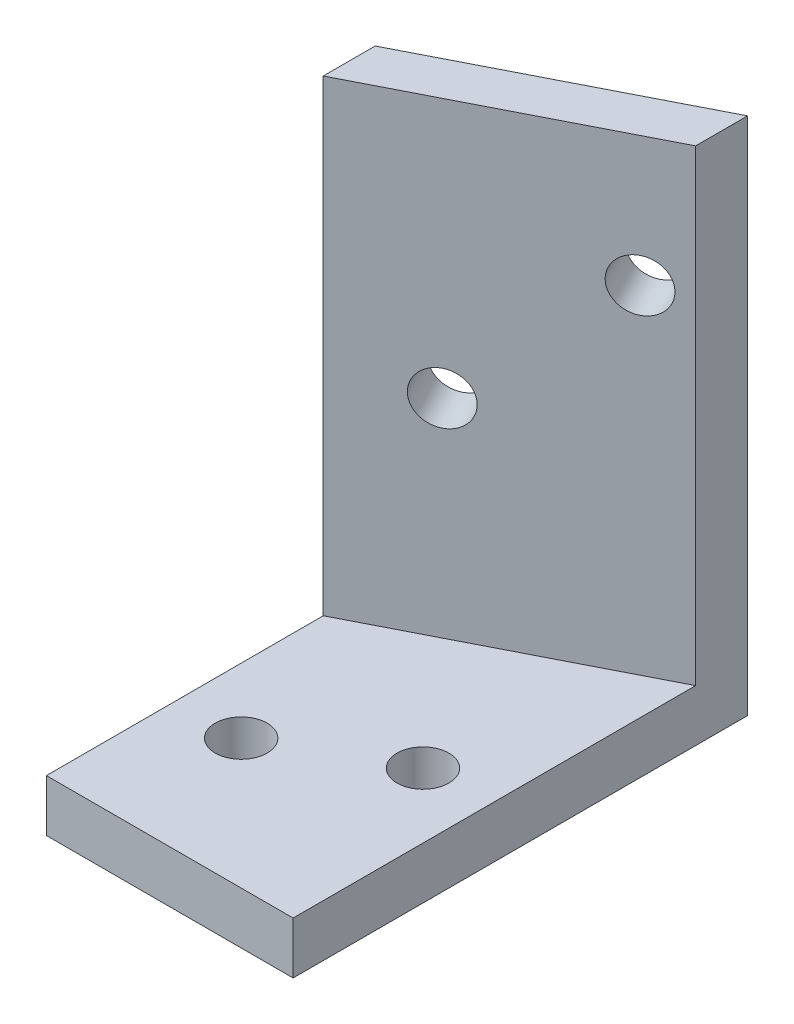
ISO-10303-21;
HEADER;
FILE_DESCRIPTION(('STEP AP214'),'2;1');
FILE_NAME('part.step','',(''),(''),'','','');
FILE_SCHEMA(('AUTOMOTIVE_DESIGN { 1 0 10303 214 1 1 1 1 }'));
ENDSEC;
DATA;
#1=APPLICATION_CONTEXT('core data for automotive mechanical design processes');
#2=APPLICATION_PROTOCOL_DEFINITION('international standard','automotive_design',2000,#1);
#3=PRODUCT_CONTEXT('',#1,'mechanical');
#4=PRODUCT('Part','Part','',(#3));
#5=PRODUCT_RELATED_PRODUCT_CATEGORY('part','',(#4));
#6=PRODUCT_DEFINITION_FORMATION('','',#4);
#7=PRODUCT_DEFINITION_CONTEXT('part definition',#1,'design');
#8=PRODUCT_DEFINITION('design','',#6,#7);
#9=PRODUCT_DEFINITION_SHAPE('','',#8);
#10=(LENGTH_UNIT() NAMED_UNIT(*) SI_UNIT(.MILLI.,.METRE.));
#11=(NAMED_UNIT(*) PLANE_ANGLE_UNIT() SI_UNIT($,.RADIAN.));
#12=(NAMED_UNIT(*) SI_UNIT($,.STERADIAN.) SOLID_ANGLE_UNIT());
#13=UNCERTAINTY_MEASURE_WITH_UNIT(LENGTH_MEASURE(1.E-05),#10,'distance_accuracy_value','');
#14=(GEOMETRIC_REPRESENTATION_CONTEXT(3) GLOBAL_UNCERTAINTY_ASSIGNED_CONTEXT((#13)) GLOBAL_UNIT_ASSIGNED_CONTEXT((#10,
#11,#12)) REPRESENTATION_CONTEXT('',''));
#15=CARTESIAN_POINT('',(0.,0.,0.));
#16=DIRECTION('',(0.,0.,1.));
#17=DIRECTION('',(1.,0.,0.));
#18=AXIS2_PLACEMENT_3D('',#15,#16,#17);
#19=CARTESIAN_POINT('',(0.,4.,0.));
#20=DIRECTION('',(0.,-1.,0.));
#21=DIRECTION('',(0.,0.,-1.));
#22=AXIS2_PLACEMENT_3D('',#19,#20,#21);
#23=PLANE('',#22);
#24=CARTESIAN_POINT('',(-4.5,4.,7.5));
#25=DIRECTION('',(0.,1.,0.));
#26=DIRECTION('',(0.,0.,1.));
#27=AXIS2_PLACEMENT_3D('',#24,#25,#26);
#28=CIRCLE('',#27,2.);
#29=CARTESIAN_POINT('',(-4.5,4.,9.5));
#30=VERTEX_POINT('',#29);
#31=EDGE_CURVE('E314',#30,#30,#28,.T.);
#32=ORIENTED_EDGE('',*,*,#31,.F.);
#33=EDGE_LOOP('',(#32));
#34=FACE_BOUND('',#33,.T.);
#35=CARTESIAN_POINT('',(4.5,4.,2.5));
#36=DIRECTION('',(0.,1.,0.));
#37=DIRECTION('',(0.,0.,1.));
#38=AXIS2_PLACEMENT_3D('',#35,#36,#37);
#39=CIRCLE('',#38,2.);
#40=CARTESIAN_POINT('',(4.5,4.,4.5));
#41=VERTEX_POINT('',#40);
#42=EDGE_CURVE('E316',#41,#41,#39,.T.);
#43=ORIENTED_EDGE('',*,*,#42,.F.);
#44=EDGE_LOOP('',(#43));
#45=FACE_BOUND('',#44,.T.);
#46=DIRECTION('',(0.891006524188369,0.,-0.453990499739545));
#47=VECTOR('',#46,1.);
#48=CARTESIAN_POINT('',(-9.5,4.,-3.81901645960591));
#49=LINE('',#48,#47);
#50=CARTESIAN_POINT('',(-9.5,4.,-3.8190164596059));
#51=VERTEX_POINT('',#50);
#52=CARTESIAN_POINT('',(9.5,4.,-13.5));
#53=VERTEX_POINT('',#52);
#54=EDGE_CURVE('E60',#51,#53,#49,.T.);
#55=ORIENTED_EDGE('',*,*,#54,.F.);
#56=DIRECTION('',(0.,0.,1.));
#57=VECTOR('',#56,1.);
#58=CARTESIAN_POINT('',(-9.5,4.,17.5));
#59=LINE('',#58,#57);
#60=CARTESIAN_POINT('',(-9.5,4.,17.5));
#61=VERTEX_POINT('',#60);
#62=EDGE_CURVE('E167',#51,#61,#59,.T.);
#63=ORIENTED_EDGE('',*,*,#62,.T.);
#64=DIRECTION('',(1.,0.,0.));
#65=VECTOR('',#64,1.);
#66=CARTESIAN_POINT('',(-9.5,4.,17.5));
#67=LINE('',#66,#65);
#68=CARTESIAN_POINT('',(9.5,4.,17.5));
#69=VERTEX_POINT('',#68);
#70=EDGE_CURVE('E66',#61,#69,#67,.T.);
#71=ORIENTED_EDGE('',*,*,#70,.T.);
#72=DIRECTION('',(0.,0.,-1.));
#73=VECTOR('',#72,1.);
#74=CARTESIAN_POINT('',(9.5,4.,17.5));
#75=LINE('',#74,#73);
#76=EDGE_CURVE('E91',#69,#53,#75,.T.);
#77=ORIENTED_EDGE('',*,*,#76,.T.);
#78=EDGE_LOOP('',(#55,#63,#71,#77));
#79=FACE_BOUND('',#78,.T.);
#80=ADVANCED_FACE('F42',(#34,#45,#79),#23,.F.);
#81=CARTESIAN_POINT('',(9.5,4.,17.5));
#82=DIRECTION('',(-1.,0.,0.));
#83=DIRECTION('',(0.,0.,1.));
#84=AXIS2_PLACEMENT_3D('',#81,#82,#83);
#85=PLANE('',#84);
#86=DIRECTION('',(0.,0.,-1.));
#87=VECTOR('',#86,1.);
#88=CARTESIAN_POINT('',(9.5,0.,17.5));
#89=LINE('',#88,#87);
#90=CARTESIAN_POINT('',(9.5,0.,17.5));
#91=VERTEX_POINT('',#90);
#92=CARTESIAN_POINT('',(9.5,0.,-17.5));
#93=VERTEX_POINT('',#92);
#94=EDGE_CURVE('E97',#91,#93,#89,.T.);
#95=ORIENTED_EDGE('',*,*,#94,.T.);
#96=DIRECTION('',(0.,-1.,0.));
#97=VECTOR('',#96,1.);
#98=CARTESIAN_POINT('',(9.5,4.,-17.5));
#99=LINE('',#98,#97);
#100=CARTESIAN_POINT('',(9.5,40.,-17.5));
#101=VERTEX_POINT('',#100);
#102=EDGE_CURVE('E11',#101,#93,#99,.T.);
#103=ORIENTED_EDGE('',*,*,#102,.F.);
#104=DIRECTION('',(0.,0.,-1.));
#105=VECTOR('',#104,1.);
#106=CARTESIAN_POINT('',(9.5,40.,-13.5));
#107=LINE('',#106,#105);
#108=CARTESIAN_POINT('',(9.5,40.,-13.5));
#109=VERTEX_POINT('',#108);
#110=EDGE_CURVE('E139',#109,#101,#107,.T.);
#111=ORIENTED_EDGE('',*,*,#110,.F.);
#112=DIRECTION('',(0.,-1.,0.));
#113=VECTOR('',#112,1.);
#114=CARTESIAN_POINT('',(9.5,40.,-13.5));
#115=LINE('',#114,#113);
#116=EDGE_CURVE('E155',#109,#53,#115,.T.);
#117=ORIENTED_EDGE('',*,*,#116,.T.);
#118=ORIENTED_EDGE('',*,*,#76,.F.);
#119=DIRECTION('',(0.,-1.,0.));
#120=VECTOR('',#119,1.);
#121=CARTESIAN_POINT('',(9.5,4.,17.5));
#122=LINE('',#121,#120);
#123=EDGE_CURVE('E84',#69,#91,#122,.T.);
#124=ORIENTED_EDGE('',*,*,#123,.T.);
#125=EDGE_LOOP('',(#95,#103,#111,#117,#118,#124));
#126=FACE_BOUND('',#125,.T.);
#127=ADVANCED_FACE('F44',(#126),#85,.F.);
#128=CARTESIAN_POINT('',(-9.5,4.,17.5));
#129=DIRECTION('',(1.,0.,0.));
#130=DIRECTION('',(0.,0.,-1.));
#131=AXIS2_PLACEMENT_3D('',#128,#129,#130);
#132=PLANE('',#131);
#133=ORIENTED_EDGE('',*,*,#62,.F.);
#134=DIRECTION('',(0.,-1.,0.));
#135=VECTOR('',#134,1.);
#136=CARTESIAN_POINT('',(-9.5,40.,-3.81901645960591));
#137=LINE('',#136,#135);
#138=CARTESIAN_POINT('',(-9.5,40.,-3.81901645960591));
#139=VERTEX_POINT('',#138);
#140=EDGE_CURVE('E160',#139,#51,#137,.T.);
#141=ORIENTED_EDGE('',*,*,#140,.F.);
#142=DIRECTION('',(0.,0.,1.));
#143=VECTOR('',#142,1.);
#144=CARTESIAN_POINT('',(-9.5,40.,-7.81901645960591));
#145=LINE('',#144,#143);
#146=CARTESIAN_POINT('',(-9.5,40.,-7.81901645960591));
#147=VERTEX_POINT('',#146);
#148=EDGE_CURVE('E147',#147,#139,#145,.T.);
#149=ORIENTED_EDGE('',*,*,#148,.F.);
#150=DIRECTION('',(0.,1.,0.));
#151=VECTOR('',#150,1.);
#152=CARTESIAN_POINT('',(-9.5,0.,-7.81901645960591));
#153=LINE('',#152,#151);
#154=CARTESIAN_POINT('',(-9.5,0.,-7.81901645960591));
#155=VERTEX_POINT('',#154);
#156=EDGE_CURVE('E106',#155,#147,#153,.T.);
#157=ORIENTED_EDGE('',*,*,#156,.F.);
#158=DIRECTION('',(0.,0.,1.));
#159=VECTOR('',#158,1.);
#160=CARTESIAN_POINT('',(-9.5,0.,17.5));
#161=LINE('',#160,#159);
#162=CARTESIAN_POINT('',(-9.5,0.,17.5));
#163=VERTEX_POINT('',#162);
#164=EDGE_CURVE('E92',#155,#163,#161,.T.);
#165=ORIENTED_EDGE('',*,*,#164,.T.);
#166=DIRECTION('',(0.,-1.,0.));
#167=VECTOR('',#166,1.);
#168=CARTESIAN_POINT('',(-9.5,4.,17.5));
#169=LINE('',#168,#167);
#170=EDGE_CURVE('E52',#61,#163,#169,.T.);
#171=ORIENTED_EDGE('',*,*,#170,.F.);
#172=EDGE_LOOP('',(#133,#141,#149,#157,#165,#171));
#173=FACE_BOUND('',#172,.T.);
#174=ADVANCED_FACE('F172',(#173),#132,.F.);
#175=CARTESIAN_POINT('',(-9.5,4.,17.5));
#176=DIRECTION('',(0.,0.,-1.));
#177=DIRECTION('',(-1.,0.,0.));
#178=AXIS2_PLACEMENT_3D('',#175,#176,#177);
#179=PLANE('',#178);
#180=DIRECTION('',(1.,0.,0.));
#181=VECTOR('',#180,1.);
#182=CARTESIAN_POINT('',(-9.5,0.,17.5));
#183=LINE('',#182,#181);
#184=EDGE_CURVE('E81',#163,#91,#183,.T.);
#185=ORIENTED_EDGE('',*,*,#184,.T.);
#186=ORIENTED_EDGE('',*,*,#123,.F.);
#187=ORIENTED_EDGE('',*,*,#70,.F.);
#188=ORIENTED_EDGE('',*,*,#170,.T.);
#189=EDGE_LOOP('',(#185,#186,#187,#188));
#190=FACE_BOUND('',#189,.T.);
#191=ADVANCED_FACE('F83',(#190),#179,.F.);
#192=CARTESIAN_POINT('',(0.,0.,0.));
#193=DIRECTION('',(0.,-1.,0.));
#194=DIRECTION('',(0.,0.,-1.));
#195=AXIS2_PLACEMENT_3D('',#192,#193,#194);
#196=PLANE('',#195);
#197=CARTESIAN_POINT('',(-4.5,0.,7.5));
#198=DIRECTION('',(0.,1.,0.));
#199=DIRECTION('',(0.,0.,1.));
#200=AXIS2_PLACEMENT_3D('',#197,#198,#199);
#201=CIRCLE('',#200,2.);
#202=CARTESIAN_POINT('',(-4.5,0.,9.5));
#203=VERTEX_POINT('',#202);
#204=EDGE_CURVE('E133',#203,#203,#201,.T.);
#205=ORIENTED_EDGE('',*,*,#204,.T.);
#206=EDGE_LOOP('',(#205));
#207=FACE_BOUND('',#206,.T.);
#208=CARTESIAN_POINT('',(4.5,0.,2.5));
#209=DIRECTION('',(0.,1.,0.));
#210=DIRECTION('',(0.,0.,1.));
#211=AXIS2_PLACEMENT_3D('',#208,#209,#210);
#212=CIRCLE('',#211,2.);
#213=CARTESIAN_POINT('',(4.5,0.,4.5));
#214=VERTEX_POINT('',#213);
#215=EDGE_CURVE('E136',#214,#214,#212,.T.);
#216=ORIENTED_EDGE('',*,*,#215,.T.);
#217=EDGE_LOOP('',(#216));
#218=FACE_BOUND('',#217,.T.);
#219=DIRECTION('',(0.891006524188369,0.,-0.453990499739545));
#220=VECTOR('',#219,1.);
#221=CARTESIAN_POINT('',(9.5,0.,-17.5));
#222=LINE('',#221,#220);
#223=EDGE_CURVE('E104',#155,#93,#222,.T.);
#224=ORIENTED_EDGE('',*,*,#223,.T.);
#225=ORIENTED_EDGE('',*,*,#94,.F.);
#226=ORIENTED_EDGE('',*,*,#184,.F.);
#227=ORIENTED_EDGE('',*,*,#164,.F.);
#228=EDGE_LOOP('',(#224,#225,#226,#227));
#229=FACE_BOUND('',#228,.T.);
#230=ADVANCED_FACE('F102',(#207,#218,#229),#196,.T.);
#231=CARTESIAN_POINT('',(9.5,0.,-17.5));
#232=DIRECTION('',(0.453990499739545,0.,0.891006524188369));
#233=DIRECTION('',(0.891006524188369,0.,-0.453990499739545));
#234=AXIS2_PLACEMENT_3D('',#231,#232,#233);
#235=PLANE('',#234);
#236=CARTESIAN_POINT('',(5.04496737905815,30.,-15.2300475013023));
#237=DIRECTION('',(-0.453990499739545,0.,-0.891006524188369));
#238=DIRECTION('',(-0.891006524188369,0.,0.453990499739545));
#239=AXIS2_PLACEMENT_3D('',#236,#237,#238);
#240=CIRCLE('',#239,2.);
#241=CARTESIAN_POINT('',(3.26295433068141,30.,-14.3220665018232));
#242=VERTEX_POINT('',#241);
#243=EDGE_CURVE('E120',#242,#242,#240,.T.);
#244=ORIENTED_EDGE('',*,*,#243,.F.);
#245=EDGE_LOOP('',(#244));
#246=FACE_BOUND('',#245,.T.);
#247=CARTESIAN_POINT('',(-5.04496737905816,20.,-10.0889689583036));
#248=DIRECTION('',(-0.453990499739545,0.,-0.891006524188369));
#249=DIRECTION('',(-0.891006524188369,0.,0.453990499739545));
#250=AXIS2_PLACEMENT_3D('',#247,#248,#249);
#251=CIRCLE('',#250,2.);
#252=CARTESIAN_POINT('',(-6.8269804274349,20.,-9.18098795882455));
#253=VERTEX_POINT('',#252);
#254=EDGE_CURVE('E127',#253,#253,#251,.T.);
#255=ORIENTED_EDGE('',*,*,#254,.F.);
#256=EDGE_LOOP('',(#255));
#257=FACE_BOUND('',#256,.T.);
#258=ORIENTED_EDGE('',*,*,#156,.T.);
#259=DIRECTION('',(-0.891006524188369,0.,0.453990499739545));
#260=VECTOR('',#259,1.);
#261=CARTESIAN_POINT('',(9.5,40.,-17.5));
#262=LINE('',#261,#260);
#263=EDGE_CURVE('E143',#101,#147,#262,.T.);
#264=ORIENTED_EDGE('',*,*,#263,.F.);
#265=ORIENTED_EDGE('',*,*,#102,.T.);
#266=ORIENTED_EDGE('',*,*,#223,.F.);
#267=EDGE_LOOP('',(#258,#264,#265,#266));
#268=FACE_BOUND('',#267,.T.);
#269=ADVANCED_FACE('F188',(#246,#257,#268),#235,.F.);
#270=CARTESIAN_POINT('',(-9.5,40.,-3.81901645960591));
#271=DIRECTION('',(-0.453990499739545,0.,-0.891006524188369));
#272=DIRECTION('',(-0.891006524188369,0.,0.453990499739545));
#273=AXIS2_PLACEMENT_3D('',#270,#271,#272);
#274=PLANE('',#273);
#275=CARTESIAN_POINT('',(6.66300136780804,30.,-12.0544769967173));
#276=DIRECTION('',(-0.453990499739545,0.,-0.891006524188369));
#277=DIRECTION('',(-0.891006524188369,0.,0.453990499739545));
#278=AXIS2_PLACEMENT_3D('',#275,#276,#277);
#279=CIRCLE('',#278,2.);
#280=CARTESIAN_POINT('',(4.8809883194313,30.,-11.1464959972382));
#281=VERTEX_POINT('',#280);
#282=EDGE_CURVE('E46',#281,#281,#279,.T.);
#283=ORIENTED_EDGE('',*,*,#282,.T.);
#284=EDGE_LOOP('',(#283));
#285=FACE_BOUND('',#284,.T.);
#286=CARTESIAN_POINT('',(-3.42693339030826,20.,-6.91339845371868));
#287=DIRECTION('',(-0.453990499739545,0.,-0.891006524188369));
#288=DIRECTION('',(-0.891006524188369,0.,0.453990499739545));
#289=AXIS2_PLACEMENT_3D('',#286,#287,#288);
#290=CIRCLE('',#289,2.);
#291=CARTESIAN_POINT('',(-5.208946438685,20.,-6.00541745423959));
#292=VERTEX_POINT('',#291);
#293=EDGE_CURVE('E117',#292,#292,#290,.T.);
#294=ORIENTED_EDGE('',*,*,#293,.T.);
#295=EDGE_LOOP('',(#294));
#296=FACE_BOUND('',#295,.T.);
#297=ORIENTED_EDGE('',*,*,#54,.T.);
#298=ORIENTED_EDGE('',*,*,#116,.F.);
#299=DIRECTION('',(0.891006524188369,0.,-0.453990499739545));
#300=VECTOR('',#299,1.);
#301=CARTESIAN_POINT('',(-9.5,40.,-3.81901645960591));
#302=LINE('',#301,#300);
#303=EDGE_CURVE('E151',#139,#109,#302,.T.);
#304=ORIENTED_EDGE('',*,*,#303,.F.);
#305=ORIENTED_EDGE('',*,*,#140,.T.);
#306=EDGE_LOOP('',(#297,#298,#304,#305));
#307=FACE_BOUND('',#306,.T.);
#308=ADVANCED_FACE('F194',(#285,#296,#307),#274,.F.);
#309=CARTESIAN_POINT('',(0.,40.,0.));
#310=DIRECTION('',(0.,1.,0.));
#311=DIRECTION('',(0.,0.,1.));
#312=AXIS2_PLACEMENT_3D('',#309,#310,#311);
#313=PLANE('',#312);
#314=ORIENTED_EDGE('',*,*,#110,.T.);
#315=ORIENTED_EDGE('',*,*,#263,.T.);
#316=ORIENTED_EDGE('',*,*,#148,.T.);
#317=ORIENTED_EDGE('',*,*,#303,.T.);
#318=EDGE_LOOP('',(#314,#315,#316,#317));
#319=FACE_BOUND('',#318,.T.);
#320=ADVANCED_FACE('F190',(#319),#313,.T.);
#321=CARTESIAN_POINT('',(9.11283002250339,20.,17.6972729568147));
#322=DIRECTION('',(-0.453990499739545,0.,-0.891006524188369));
#323=DIRECTION('',(-0.891006524188369,0.,0.453990499739545));
#324=AXIS2_PLACEMENT_3D('',#321,#322,#323);
#325=CYLINDRICAL_SURFACE('',#324,2.);
#326=ORIENTED_EDGE('',*,*,#254,.T.);
#327=EDGE_LOOP('',(#326));
#328=FACE_BOUND('',#327,.T.);
#329=ORIENTED_EDGE('',*,*,#293,.F.);
#330=EDGE_LOOP('',(#329));
#331=FACE_BOUND('',#330,.T.);
#332=ADVANCED_FACE('F202',(#328,#331),#325,.F.);
#333=CARTESIAN_POINT('',(19.2027647806197,30.,12.5561944138161));
#334=DIRECTION('',(-0.453990499739545,0.,-0.891006524188369));
#335=DIRECTION('',(-0.891006524188369,0.,0.453990499739545));
#336=AXIS2_PLACEMENT_3D('',#333,#334,#335);
#337=CYLINDRICAL_SURFACE('',#336,2.);
#338=ORIENTED_EDGE('',*,*,#243,.T.);
#339=EDGE_LOOP('',(#338));
#340=FACE_BOUND('',#339,.T.);
#341=ORIENTED_EDGE('',*,*,#282,.F.);
#342=EDGE_LOOP('',(#341));
#343=FACE_BOUND('',#342,.T.);
#344=ADVANCED_FACE('F255',(#340,#343),#337,.F.);
#345=CARTESIAN_POINT('',(4.5,0.,2.5));
#346=DIRECTION('',(0.,1.,0.));
#347=DIRECTION('',(0.,0.,1.));
#348=AXIS2_PLACEMENT_3D('',#345,#346,#347);
#349=CYLINDRICAL_SURFACE('',#348,2.);
#350=ORIENTED_EDGE('',*,*,#215,.F.);
#351=EDGE_LOOP('',(#350));
#352=FACE_BOUND('',#351,.T.);
#353=ORIENTED_EDGE('',*,*,#42,.T.);
#354=EDGE_LOOP('',(#353));
#355=FACE_BOUND('',#354,.T.);
#356=ADVANCED_FACE('F265',(#352,#355),#349,.F.);
#357=CARTESIAN_POINT('',(-4.5,0.,7.5));
#358=DIRECTION('',(0.,1.,0.));
#359=DIRECTION('',(0.,0.,1.));
#360=AXIS2_PLACEMENT_3D('',#357,#358,#359);
#361=CYLINDRICAL_SURFACE('',#360,2.);
#362=ORIENTED_EDGE('',*,*,#204,.F.);
#363=EDGE_LOOP('',(#362));
#364=FACE_BOUND('',#363,.T.);
#365=ORIENTED_EDGE('',*,*,#31,.T.);
#366=EDGE_LOOP('',(#365));
#367=FACE_BOUND('',#366,.T.);
#368=ADVANCED_FACE('F293',(#364,#367),#361,.F.);
#369=CLOSED_SHELL('',(#80,#127,#174,#191,#230,#269,#308,#320,#332,#344,#356,#368));
#370=MANIFOLD_SOLID_BREP('B2',#369);
#371=ADVANCED_BREP_SHAPE_REPRESENTATION('',(#18,#370),#14);
#372=SHAPE_DEFINITION_REPRESENTATION(#9,#371);
ENDSEC;
END-ISO-10303-21;
